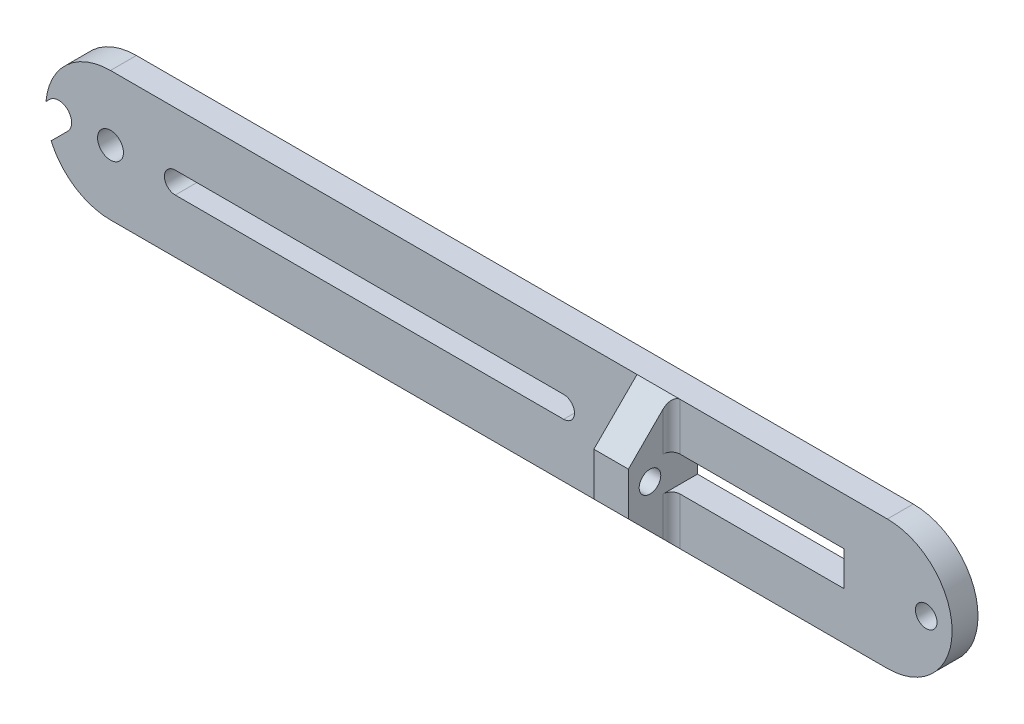
ISO-10303-21;
HEADER;
FILE_DESCRIPTION(('STEP AP214'),'2;1');
FILE_NAME('part.step','',(''),(''),'','','');
FILE_SCHEMA(('AUTOMOTIVE_DESIGN { 1 0 10303 214 1 1 1 1 }'));
ENDSEC;
DATA;
#1=APPLICATION_CONTEXT('core data for automotive mechanical design processes');
#2=APPLICATION_PROTOCOL_DEFINITION('international standard','automotive_design',2000,#1);
#3=PRODUCT_CONTEXT('',#1,'mechanical');
#4=PRODUCT('Part','Part','',(#3));
#5=PRODUCT_RELATED_PRODUCT_CATEGORY('part','',(#4));
#6=PRODUCT_DEFINITION_FORMATION('','',#4);
#7=PRODUCT_DEFINITION_CONTEXT('part definition',#1,'design');
#8=PRODUCT_DEFINITION('design','',#6,#7);
#9=PRODUCT_DEFINITION_SHAPE('','',#8);
#10=(LENGTH_UNIT() NAMED_UNIT(*) SI_UNIT(.MILLI.,.METRE.));
#11=(NAMED_UNIT(*) PLANE_ANGLE_UNIT() SI_UNIT($,.RADIAN.));
#12=(NAMED_UNIT(*) SI_UNIT($,.STERADIAN.) SOLID_ANGLE_UNIT());
#13=UNCERTAINTY_MEASURE_WITH_UNIT(LENGTH_MEASURE(1.E-05),#10,'distance_accuracy_value','');
#14=(GEOMETRIC_REPRESENTATION_CONTEXT(3) GLOBAL_UNCERTAINTY_ASSIGNED_CONTEXT((#13)) GLOBAL_UNIT_ASSIGNED_CONTEXT((#10,
#11,#12)) REPRESENTATION_CONTEXT('',''));
#15=CARTESIAN_POINT('',(0.,0.,0.));
#16=DIRECTION('',(0.,0.,1.));
#17=DIRECTION('',(1.,0.,0.));
#18=AXIS2_PLACEMENT_3D('',#15,#16,#17);
#19=CARTESIAN_POINT('',(90.,0.,6.));
#20=DIRECTION('',(0.,0.,1.));
#21=DIRECTION('',(1.,0.,0.));
#22=AXIS2_PLACEMENT_3D('',#19,#20,#21);
#23=PLANE('',#22);
#24=DIRECTION('',(-1.,0.,0.));
#25=VECTOR('',#24,1.);
#26=CARTESIAN_POINT('',(-75.,2.50000000000001,6.));
#27=LINE('',#26,#25);
#28=CARTESIAN_POINT('',(15.,2.5,6.));
#29=VERTEX_POINT('',#28);
#30=CARTESIAN_POINT('',(-75.,2.50000000000001,6.));
#31=VERTEX_POINT('',#30);
#32=EDGE_CURVE('E407',#29,#31,#27,.T.);
#33=ORIENTED_EDGE('',*,*,#32,.F.);
#34=CARTESIAN_POINT('',(15.,0.,6.));
#35=DIRECTION('',(0.,0.,1.));
#36=DIRECTION('',(1.,0.,0.));
#37=AXIS2_PLACEMENT_3D('',#34,#35,#36);
#38=CIRCLE('',#37,2.5);
#39=CARTESIAN_POINT('',(15.,-2.5,6.));
#40=VERTEX_POINT('',#39);
#41=EDGE_CURVE('E405',#40,#29,#38,.T.);
#42=ORIENTED_EDGE('',*,*,#41,.F.);
#43=DIRECTION('',(1.,0.,0.));
#44=VECTOR('',#43,1.);
#45=CARTESIAN_POINT('',(15.,-2.5,6.));
#46=LINE('',#45,#44);
#47=CARTESIAN_POINT('',(-75.,-2.50000000000001,6.));
#48=VERTEX_POINT('',#47);
#49=EDGE_CURVE('E413',#48,#40,#46,.T.);
#50=ORIENTED_EDGE('',*,*,#49,.F.);
#51=CARTESIAN_POINT('',(-75.,0.,6.));
#52=DIRECTION('',(0.,0.,1.));
#53=DIRECTION('',(1.,0.,0.));
#54=AXIS2_PLACEMENT_3D('',#51,#52,#53);
#55=CIRCLE('',#54,2.50000000000001);
#56=EDGE_CURVE('E410',#31,#48,#55,.T.);
#57=ORIENTED_EDGE('',*,*,#56,.F.);
#58=EDGE_LOOP('',(#33,#42,#50,#57));
#59=FACE_BOUND('',#58,.T.);
#60=CARTESIAN_POINT('',(-90.,0.,6.));
#61=DIRECTION('',(0.,0.,1.));
#62=DIRECTION('',(-1.,0.,0.));
#63=AXIS2_PLACEMENT_3D('',#60,#61,#62);
#64=CIRCLE('',#63,3.00000000000001);
#65=CARTESIAN_POINT('',(-93.,0.,6.));
#66=VERTEX_POINT('',#65);
#67=EDGE_CURVE('E436',#66,#66,#64,.T.);
#68=ORIENTED_EDGE('',*,*,#67,.F.);
#69=EDGE_LOOP('',(#68));
#70=FACE_BOUND('',#69,.T.);
#71=CARTESIAN_POINT('',(-102.,0.,6.));
#72=DIRECTION('',(0.,0.,1.));
#73=DIRECTION('',(1.,0.,0.));
#74=AXIS2_PLACEMENT_3D('',#71,#72,#73);
#75=CIRCLE('',#74,3.00000000000001);
#76=CARTESIAN_POINT('',(-99.8786796564403,-2.12132034355963,6.));
#77=VERTEX_POINT('',#76);
#78=CARTESIAN_POINT('',(-104.12132034356,2.12132034355962,6.));
#79=VERTEX_POINT('',#78);
#80=EDGE_CURVE('E223',#77,#79,#75,.T.);
#81=ORIENTED_EDGE('',*,*,#80,.F.);
#82=DIRECTION('',(-0.707106781186543,-0.707106781186552,0.));
#83=VECTOR('',#82,1.);
#84=CARTESIAN_POINT('',(-48.878679656441,48.8786796564403,6.));
#85=LINE('',#84,#83);
#86=CARTESIAN_POINT('',(-103.750652312537,-5.99329299965612,6.));
#87=VERTEX_POINT('',#86);
#88=EDGE_CURVE('E229',#77,#87,#85,.T.);
#89=ORIENTED_EDGE('',*,*,#88,.T.);
#90=CARTESIAN_POINT('',(-90.,0.,6.));
#91=DIRECTION('',(0.,0.,1.));
#92=DIRECTION('',(-1.,0.,0.));
#93=AXIS2_PLACEMENT_3D('',#90,#91,#92);
#94=CIRCLE('',#93,15.);
#95=CARTESIAN_POINT('',(-90.,-15.,6.));
#96=VERTEX_POINT('',#95);
#97=EDGE_CURVE('E373',#87,#96,#94,.T.);
#98=ORIENTED_EDGE('',*,*,#97,.T.);
#99=DIRECTION('',(1.,0.,0.));
#100=VECTOR('',#99,1.);
#101=CARTESIAN_POINT('',(90.,-15.,6.));
#102=LINE('',#101,#100);
#103=CARTESIAN_POINT('',(32.,-15.,6.));
#104=VERTEX_POINT('',#103);
#105=EDGE_CURVE('E375',#96,#104,#102,.T.);
#106=ORIENTED_EDGE('',*,*,#105,.T.);
#107=DIRECTION('',(0.,1.,0.));
#108=VECTOR('',#107,1.);
#109=CARTESIAN_POINT('',(32.,-15.,6.));
#110=LINE('',#109,#108);
#111=CARTESIAN_POINT('',(32.,15.,6.));
#112=VERTEX_POINT('',#111);
#113=EDGE_CURVE('E301',#104,#112,#110,.T.);
#114=ORIENTED_EDGE('',*,*,#113,.T.);
#115=DIRECTION('',(-1.,0.,0.));
#116=VECTOR('',#115,1.);
#117=CARTESIAN_POINT('',(90.,15.,6.));
#118=LINE('',#117,#116);
#119=CARTESIAN_POINT('',(-90.,15.,6.));
#120=VERTEX_POINT('',#119);
#121=EDGE_CURVE('E371',#112,#120,#118,.T.);
#122=ORIENTED_EDGE('',*,*,#121,.T.);
#123=CARTESIAN_POINT('',(-104.943648089812,1.29899259730734,6.));
#124=VERTEX_POINT('',#123);
#125=EDGE_CURVE('E367',#120,#124,#94,.T.);
#126=ORIENTED_EDGE('',*,*,#125,.T.);
#127=DIRECTION('',(-0.707106781186544,-0.707106781186552,0.));
#128=VECTOR('',#127,1.);
#129=CARTESIAN_POINT('',(-53.1213203435602,53.1213203435596,6.));
#130=LINE('',#129,#128);
#131=EDGE_CURVE('E48',#79,#124,#130,.T.);
#132=ORIENTED_EDGE('',*,*,#131,.F.);
#133=EDGE_LOOP('',(#81,#89,#98,#106,#114,#122,#126,#132));
#134=FACE_BOUND('',#133,.T.);
#135=ADVANCED_FACE('F33',(#59,#70,#134),#23,.T.);
#136=CARTESIAN_POINT('',(90.,0.,0.));
#137=DIRECTION('',(0.,0.,1.));
#138=DIRECTION('',(1.,0.,0.));
#139=AXIS2_PLACEMENT_3D('',#136,#137,#138);
#140=PLANE('',#139);
#141=CARTESIAN_POINT('',(15.,0.,0.));
#142=DIRECTION('',(0.,0.,1.));
#143=DIRECTION('',(1.,0.,0.));
#144=AXIS2_PLACEMENT_3D('',#141,#142,#143);
#145=CIRCLE('',#144,2.5);
#146=CARTESIAN_POINT('',(15.,-2.5,0.));
#147=VERTEX_POINT('',#146);
#148=CARTESIAN_POINT('',(15.,2.5,0.));
#149=VERTEX_POINT('',#148);
#150=EDGE_CURVE('E311',#147,#149,#145,.T.);
#151=ORIENTED_EDGE('',*,*,#150,.T.);
#152=DIRECTION('',(-1.,0.,0.));
#153=VECTOR('',#152,1.);
#154=CARTESIAN_POINT('',(-75.,2.50000000000001,0.));
#155=LINE('',#154,#153);
#156=CARTESIAN_POINT('',(-75.,2.50000000000001,0.));
#157=VERTEX_POINT('',#156);
#158=EDGE_CURVE('E418',#149,#157,#155,.T.);
#159=ORIENTED_EDGE('',*,*,#158,.T.);
#160=CARTESIAN_POINT('',(-75.,0.,0.));
#161=DIRECTION('',(0.,0.,1.));
#162=DIRECTION('',(1.,0.,0.));
#163=AXIS2_PLACEMENT_3D('',#160,#161,#162);
#164=CIRCLE('',#163,2.50000000000001);
#165=CARTESIAN_POINT('',(-75.,-2.50000000000001,0.));
#166=VERTEX_POINT('',#165);
#167=EDGE_CURVE('E421',#157,#166,#164,.T.);
#168=ORIENTED_EDGE('',*,*,#167,.T.);
#169=DIRECTION('',(1.,0.,0.));
#170=VECTOR('',#169,1.);
#171=CARTESIAN_POINT('',(15.,-2.5,0.));
#172=LINE('',#171,#170);
#173=EDGE_CURVE('E408',#166,#147,#172,.T.);
#174=ORIENTED_EDGE('',*,*,#173,.T.);
#175=EDGE_LOOP('',(#151,#159,#168,#174));
#176=FACE_BOUND('',#175,.T.);
#177=CARTESIAN_POINT('',(99.,0.,0.));
#178=DIRECTION('',(0.,0.,1.));
#179=DIRECTION('',(1.,0.,0.));
#180=AXIS2_PLACEMENT_3D('',#177,#178,#179);
#181=CIRCLE('',#180,2.49999999999999);
#182=CARTESIAN_POINT('',(101.5,0.,0.));
#183=VERTEX_POINT('',#182);
#184=EDGE_CURVE('E460',#183,#183,#181,.T.);
#185=ORIENTED_EDGE('',*,*,#184,.T.);
#186=EDGE_LOOP('',(#185));
#187=FACE_BOUND('',#186,.T.);
#188=DIRECTION('',(0.,1.,0.));
#189=VECTOR('',#188,1.);
#190=CARTESIAN_POINT('',(80.,-4.,0.));
#191=LINE('',#190,#189);
#192=CARTESIAN_POINT('',(80.,-4.,0.));
#193=VERTEX_POINT('',#192);
#194=CARTESIAN_POINT('',(80.,4.,0.));
#195=VERTEX_POINT('',#194);
#196=EDGE_CURVE('E439',#193,#195,#191,.T.);
#197=ORIENTED_EDGE('',*,*,#196,.T.);
#198=DIRECTION('',(-1.,0.,0.));
#199=VECTOR('',#198,1.);
#200=CARTESIAN_POINT('',(40.,4.,0.));
#201=LINE('',#200,#199);
#202=CARTESIAN_POINT('',(40.,4.,0.));
#203=VERTEX_POINT('',#202);
#204=EDGE_CURVE('E447',#195,#203,#201,.T.);
#205=ORIENTED_EDGE('',*,*,#204,.T.);
#206=DIRECTION('',(0.,-1.,0.));
#207=VECTOR('',#206,1.);
#208=CARTESIAN_POINT('',(40.,-4.,0.));
#209=LINE('',#208,#207);
#210=CARTESIAN_POINT('',(40.,-4.,0.));
#211=VERTEX_POINT('',#210);
#212=EDGE_CURVE('E450',#203,#211,#209,.T.);
#213=ORIENTED_EDGE('',*,*,#212,.T.);
#214=DIRECTION('',(1.,0.,0.));
#215=VECTOR('',#214,1.);
#216=CARTESIAN_POINT('',(40.,-4.,0.));
#217=LINE('',#216,#215);
#218=EDGE_CURVE('E444',#211,#193,#217,.T.);
#219=ORIENTED_EDGE('',*,*,#218,.T.);
#220=EDGE_LOOP('',(#197,#205,#213,#219));
#221=FACE_BOUND('',#220,.T.);
#222=CARTESIAN_POINT('',(-90.,0.,0.));
#223=DIRECTION('',(0.,0.,1.));
#224=DIRECTION('',(-1.,0.,0.));
#225=AXIS2_PLACEMENT_3D('',#222,#223,#224);
#226=CIRCLE('',#225,3.00000000000001);
#227=CARTESIAN_POINT('',(-93.,0.,0.));
#228=VERTEX_POINT('',#227);
#229=EDGE_CURVE('E435',#228,#228,#226,.T.);
#230=ORIENTED_EDGE('',*,*,#229,.T.);
#231=EDGE_LOOP('',(#230));
#232=FACE_BOUND('',#231,.T.);
#233=DIRECTION('',(-0.707106781186543,-0.707106781186552,0.));
#234=VECTOR('',#233,1.);
#235=CARTESIAN_POINT('',(-3.87867965644158,93.8786796564403,0.));
#236=LINE('',#235,#234);
#237=CARTESIAN_POINT('',(-99.8786796564403,-2.12132034355963,0.));
#238=VERTEX_POINT('',#237);
#239=CARTESIAN_POINT('',(-103.750652312537,-5.99329299965612,0.));
#240=VERTEX_POINT('',#239);
#241=EDGE_CURVE('E243',#238,#240,#236,.T.);
#242=ORIENTED_EDGE('',*,*,#241,.F.);
#243=CARTESIAN_POINT('',(-102.,0.,0.));
#244=DIRECTION('',(0.,0.,1.));
#245=DIRECTION('',(1.,0.,0.));
#246=AXIS2_PLACEMENT_3D('',#243,#244,#245);
#247=CIRCLE('',#246,3.00000000000001);
#248=CARTESIAN_POINT('',(-104.12132034356,2.12132034355962,0.));
#249=VERTEX_POINT('',#248);
#250=EDGE_CURVE('E11',#238,#249,#247,.T.);
#251=ORIENTED_EDGE('',*,*,#250,.T.);
#252=DIRECTION('',(-0.707106781186544,-0.707106781186552,0.));
#253=VECTOR('',#252,1.);
#254=CARTESIAN_POINT('',(-8.12132034356074,98.1213203435596,0.));
#255=LINE('',#254,#253);
#256=CARTESIAN_POINT('',(-104.943648089812,1.29899259730734,0.));
#257=VERTEX_POINT('',#256);
#258=EDGE_CURVE('E239',#249,#257,#255,.T.);
#259=ORIENTED_EDGE('',*,*,#258,.T.);
#260=CARTESIAN_POINT('',(-90.,0.,0.));
#261=DIRECTION('',(0.,0.,1.));
#262=DIRECTION('',(-1.,0.,0.));
#263=AXIS2_PLACEMENT_3D('',#260,#261,#262);
#264=CIRCLE('',#263,15.);
#265=CARTESIAN_POINT('',(-90.,15.,0.));
#266=VERTEX_POINT('',#265);
#267=EDGE_CURVE('E369',#266,#257,#264,.T.);
#268=ORIENTED_EDGE('',*,*,#267,.F.);
#269=DIRECTION('',(-1.,0.,0.));
#270=VECTOR('',#269,1.);
#271=CARTESIAN_POINT('',(90.,15.,0.));
#272=LINE('',#271,#270);
#273=CARTESIAN_POINT('',(90.,15.,0.));
#274=VERTEX_POINT('',#273);
#275=EDGE_CURVE('E532',#274,#266,#272,.T.);
#276=ORIENTED_EDGE('',*,*,#275,.F.);
#277=CARTESIAN_POINT('',(90.,0.,0.));
#278=DIRECTION('',(0.,0.,1.));
#279=DIRECTION('',(1.,0.,0.));
#280=AXIS2_PLACEMENT_3D('',#277,#278,#279);
#281=CIRCLE('',#280,15.);
#282=CARTESIAN_POINT('',(90.,-15.,0.));
#283=VERTEX_POINT('',#282);
#284=EDGE_CURVE('E382',#283,#274,#281,.T.);
#285=ORIENTED_EDGE('',*,*,#284,.F.);
#286=DIRECTION('',(1.,0.,0.));
#287=VECTOR('',#286,1.);
#288=CARTESIAN_POINT('',(90.,-15.,0.));
#289=LINE('',#288,#287);
#290=CARTESIAN_POINT('',(-90.,-15.,0.));
#291=VERTEX_POINT('',#290);
#292=EDGE_CURVE('E467',#291,#283,#289,.T.);
#293=ORIENTED_EDGE('',*,*,#292,.F.);
#294=EDGE_CURVE('E477',#240,#291,#264,.T.);
#295=ORIENTED_EDGE('',*,*,#294,.F.);
#296=EDGE_LOOP('',(#242,#251,#259,#268,#276,#285,#293,#295));
#297=FACE_BOUND('',#296,.T.);
#298=ADVANCED_FACE('F513',(#176,#187,#221,#232,#297),#140,.F.);
#299=CARTESIAN_POINT('',(-90.,0.,6.));
#300=DIRECTION('',(0.,0.,-1.));
#301=DIRECTION('',(-1.,0.,0.));
#302=AXIS2_PLACEMENT_3D('',#299,#300,#301);
#303=CYLINDRICAL_SURFACE('',#302,15.);
#304=DIRECTION('',(0.,0.,-1.));
#305=VECTOR('',#304,1.);
#306=CARTESIAN_POINT('',(-103.750652312537,-5.99329299965612,6.));
#307=LINE('',#306,#305);
#308=EDGE_CURVE('E41',#240,#87,#307,.F.);
#309=ORIENTED_EDGE('',*,*,#308,.F.);
#310=ORIENTED_EDGE('',*,*,#294,.T.);
#311=DIRECTION('',(0.,0.,-1.));
#312=VECTOR('',#311,1.);
#313=CARTESIAN_POINT('',(-90.,-15.,6.));
#314=LINE('',#313,#312);
#315=EDGE_CURVE('E481',#96,#291,#314,.T.);
#316=ORIENTED_EDGE('',*,*,#315,.F.);
#317=ORIENTED_EDGE('',*,*,#97,.F.);
#318=EDGE_LOOP('',(#309,#310,#316,#317));
#319=FACE_BOUND('',#318,.T.);
#320=ADVANCED_FACE('F548',(#319),#303,.T.);
#321=CARTESIAN_POINT('',(90.,15.,6.));
#322=VERTEX_POINT('',#321);
#323=CARTESIAN_POINT('',(42.,15.,6.));
#324=VERTEX_POINT('',#323);
#325=EDGE_CURVE('E376',#322,#324,#118,.T.);
#326=ORIENTED_EDGE('',*,*,#325,.T.);
#327=DIRECTION('',(0.,1.,0.));
#328=VECTOR('',#327,1.);
#329=CARTESIAN_POINT('',(42.,4.,6.));
#330=LINE('',#329,#328);
#331=CARTESIAN_POINT('',(42.,4.,6.));
#332=VERTEX_POINT('',#331);
#333=EDGE_CURVE('E346',#324,#332,#330,.F.);
#334=ORIENTED_EDGE('',*,*,#333,.T.);
#335=DIRECTION('',(-1.,0.,0.));
#336=VECTOR('',#335,1.);
#337=CARTESIAN_POINT('',(40.,4.,6.));
#338=LINE('',#337,#336);
#339=CARTESIAN_POINT('',(80.,4.,6.));
#340=VERTEX_POINT('',#339);
#341=EDGE_CURVE('E334',#340,#332,#338,.T.);
#342=ORIENTED_EDGE('',*,*,#341,.F.);
#343=DIRECTION('',(0.,1.,0.));
#344=VECTOR('',#343,1.);
#345=CARTESIAN_POINT('',(80.,-4.,6.));
#346=LINE('',#345,#344);
#347=CARTESIAN_POINT('',(80.,-4.,6.));
#348=VERTEX_POINT('',#347);
#349=EDGE_CURVE('E442',#348,#340,#346,.T.);
#350=ORIENTED_EDGE('',*,*,#349,.F.);
#351=DIRECTION('',(1.,0.,0.));
#352=VECTOR('',#351,1.);
#353=CARTESIAN_POINT('',(40.,-4.,6.));
#354=LINE('',#353,#352);
#355=CARTESIAN_POINT('',(42.,-4.,6.));
#356=VERTEX_POINT('',#355);
#357=EDGE_CURVE('E337',#356,#348,#354,.T.);
#358=ORIENTED_EDGE('',*,*,#357,.F.);
#359=DIRECTION('',(0.,1.,0.));
#360=VECTOR('',#359,1.);
#361=CARTESIAN_POINT('',(42.,-15.,6.));
#362=LINE('',#361,#360);
#363=CARTESIAN_POINT('',(42.,-15.,6.));
#364=VERTEX_POINT('',#363);
#365=EDGE_CURVE('E343',#356,#364,#362,.F.);
#366=ORIENTED_EDGE('',*,*,#365,.T.);
#367=CARTESIAN_POINT('',(90.,-15.,6.));
#368=VERTEX_POINT('',#367);
#369=EDGE_CURVE('E340',#364,#368,#102,.T.);
#370=ORIENTED_EDGE('',*,*,#369,.T.);
#371=CARTESIAN_POINT('',(90.,0.,6.));
#372=DIRECTION('',(0.,0.,1.));
#373=DIRECTION('',(1.,0.,0.));
#374=AXIS2_PLACEMENT_3D('',#371,#372,#373);
#375=CIRCLE('',#374,15.);
#376=EDGE_CURVE('E465',#368,#322,#375,.T.);
#377=ORIENTED_EDGE('',*,*,#376,.T.);
#378=EDGE_LOOP('',(#326,#334,#342,#350,#358,#366,#370,#377));
#379=FACE_BOUND('',#378,.T.);
#380=CARTESIAN_POINT('',(99.,0.,6.));
#381=DIRECTION('',(0.,0.,1.));
#382=DIRECTION('',(1.,0.,0.));
#383=AXIS2_PLACEMENT_3D('',#380,#381,#382);
#384=CIRCLE('',#383,2.49999999999999);
#385=CARTESIAN_POINT('',(101.5,0.,6.));
#386=VERTEX_POINT('',#385);
#387=EDGE_CURVE('E461',#386,#386,#384,.T.);
#388=ORIENTED_EDGE('',*,*,#387,.F.);
#389=EDGE_LOOP('',(#388));
#390=FACE_BOUND('',#389,.T.);
#391=ADVANCED_FACE('F488',(#379,#390),#23,.T.);
#392=CARTESIAN_POINT('',(90.,0.,6.));
#393=DIRECTION('',(0.,0.,-1.));
#394=DIRECTION('',(-1.,0.,0.));
#395=AXIS2_PLACEMENT_3D('',#392,#393,#394);
#396=CYLINDRICAL_SURFACE('',#395,15.);
#397=ORIENTED_EDGE('',*,*,#284,.T.);
#398=DIRECTION('',(0.,0.,-1.));
#399=VECTOR('',#398,1.);
#400=CARTESIAN_POINT('',(90.,15.,6.));
#401=LINE('',#400,#399);
#402=EDGE_CURVE('E485',#322,#274,#401,.T.);
#403=ORIENTED_EDGE('',*,*,#402,.F.);
#404=ORIENTED_EDGE('',*,*,#376,.F.);
#405=DIRECTION('',(0.,0.,-1.));
#406=VECTOR('',#405,1.);
#407=CARTESIAN_POINT('',(90.,-15.,6.));
#408=LINE('',#407,#406);
#409=EDGE_CURVE('E389',#368,#283,#408,.T.);
#410=ORIENTED_EDGE('',*,*,#409,.T.);
#411=EDGE_LOOP('',(#397,#403,#404,#410));
#412=FACE_BOUND('',#411,.T.);
#413=ADVANCED_FACE('F530',(#412),#396,.T.);
#414=CARTESIAN_POINT('',(90.,15.,6.));
#415=DIRECTION('',(0.,-1.,0.));
#416=DIRECTION('',(0.,0.,-1.));
#417=AXIS2_PLACEMENT_3D('',#414,#415,#416);
#418=PLANE('',#417);
#419=ORIENTED_EDGE('',*,*,#275,.T.);
#420=DIRECTION('',(0.,0.,-1.));
#421=VECTOR('',#420,1.);
#422=CARTESIAN_POINT('',(-90.,15.,6.));
#423=LINE('',#422,#421);
#424=EDGE_CURVE('E483',#120,#266,#423,.T.);
#425=ORIENTED_EDGE('',*,*,#424,.F.);
#426=ORIENTED_EDGE('',*,*,#121,.F.);
#427=DIRECTION('',(1.,0.,0.));
#428=VECTOR('',#427,1.);
#429=CARTESIAN_POINT('',(32.,15.,6.));
#430=LINE('',#429,#428);
#431=EDGE_CURVE('E318',#112,#324,#430,.T.);
#432=ORIENTED_EDGE('',*,*,#431,.T.);
#433=ORIENTED_EDGE('',*,*,#325,.F.);
#434=ORIENTED_EDGE('',*,*,#402,.T.);
#435=EDGE_LOOP('',(#419,#425,#426,#432,#433,#434));
#436=FACE_BOUND('',#435,.T.);
#437=ADVANCED_FACE('F531',(#436),#418,.F.);
#438=ORIENTED_EDGE('',*,*,#267,.T.);
#439=DIRECTION('',(0.,0.,-1.));
#440=VECTOR('',#439,1.);
#441=CARTESIAN_POINT('',(-104.943648089812,1.29899259730734,6.));
#442=LINE('',#441,#440);
#443=EDGE_CURVE('E359',#257,#124,#442,.F.);
#444=ORIENTED_EDGE('',*,*,#443,.T.);
#445=ORIENTED_EDGE('',*,*,#125,.F.);
#446=ORIENTED_EDGE('',*,*,#424,.T.);
#447=EDGE_LOOP('',(#438,#444,#445,#446));
#448=FACE_BOUND('',#447,.T.);
#449=ADVANCED_FACE('F365',(#448),#303,.T.);
#450=CARTESIAN_POINT('',(90.,-15.,6.));
#451=DIRECTION('',(0.,1.,0.));
#452=DIRECTION('',(0.,0.,1.));
#453=AXIS2_PLACEMENT_3D('',#450,#451,#452);
#454=PLANE('',#453);
#455=ORIENTED_EDGE('',*,*,#292,.T.);
#456=ORIENTED_EDGE('',*,*,#409,.F.);
#457=ORIENTED_EDGE('',*,*,#369,.F.);
#458=DIRECTION('',(1.,0.,0.));
#459=VECTOR('',#458,1.);
#460=CARTESIAN_POINT('',(32.,-15.,6.));
#461=LINE('',#460,#459);
#462=EDGE_CURVE('E309',#104,#364,#461,.T.);
#463=ORIENTED_EDGE('',*,*,#462,.F.);
#464=ORIENTED_EDGE('',*,*,#105,.F.);
#465=ORIENTED_EDGE('',*,*,#315,.T.);
#466=EDGE_LOOP('',(#455,#456,#457,#463,#464,#465));
#467=FACE_BOUND('',#466,.T.);
#468=ADVANCED_FACE('F525',(#467),#454,.F.);
#469=CARTESIAN_POINT('',(99.,0.,6.));
#470=DIRECTION('',(0.,0.,-1.));
#471=DIRECTION('',(-1.,0.,0.));
#472=AXIS2_PLACEMENT_3D('',#469,#470,#471);
#473=CYLINDRICAL_SURFACE('',#472,2.49999999999999);
#474=ORIENTED_EDGE('',*,*,#387,.T.);
#475=EDGE_LOOP('',(#474));
#476=FACE_BOUND('',#475,.T.);
#477=ORIENTED_EDGE('',*,*,#184,.F.);
#478=EDGE_LOOP('',(#477));
#479=FACE_BOUND('',#478,.T.);
#480=ADVANCED_FACE('F571',(#476,#479),#473,.F.);
#481=CARTESIAN_POINT('',(80.,-4.,6.));
#482=DIRECTION('',(-1.,0.,0.));
#483=DIRECTION('',(0.,0.,1.));
#484=AXIS2_PLACEMENT_3D('',#481,#482,#483);
#485=PLANE('',#484);
#486=ORIENTED_EDGE('',*,*,#196,.F.);
#487=DIRECTION('',(0.,0.,-1.));
#488=VECTOR('',#487,1.);
#489=CARTESIAN_POINT('',(80.,-4.,6.));
#490=LINE('',#489,#488);
#491=EDGE_CURVE('E329',#348,#193,#490,.T.);
#492=ORIENTED_EDGE('',*,*,#491,.F.);
#493=ORIENTED_EDGE('',*,*,#349,.T.);
#494=DIRECTION('',(0.,0.,-1.));
#495=VECTOR('',#494,1.);
#496=CARTESIAN_POINT('',(80.,4.,6.));
#497=LINE('',#496,#495);
#498=EDGE_CURVE('E457',#340,#195,#497,.T.);
#499=ORIENTED_EDGE('',*,*,#498,.T.);
#500=EDGE_LOOP('',(#486,#492,#493,#499));
#501=FACE_BOUND('',#500,.T.);
#502=ADVANCED_FACE('F508',(#501),#485,.T.);
#503=CARTESIAN_POINT('',(40.,4.,6.));
#504=DIRECTION('',(0.,-1.,0.));
#505=DIRECTION('',(0.,0.,-1.));
#506=AXIS2_PLACEMENT_3D('',#503,#504,#505);
#507=PLANE('',#506);
#508=ORIENTED_EDGE('',*,*,#204,.F.);
#509=ORIENTED_EDGE('',*,*,#498,.F.);
#510=ORIENTED_EDGE('',*,*,#341,.T.);
#511=CARTESIAN_POINT('',(42.,4.,8.));
#512=DIRECTION('',(0.,-1.,0.));
#513=DIRECTION('',(0.,0.,-1.));
#514=AXIS2_PLACEMENT_3D('',#511,#512,#513);
#515=CIRCLE('',#514,2.);
#516=CARTESIAN_POINT('',(40.,4.,8.));
#517=VERTEX_POINT('',#516);
#518=EDGE_CURVE('E352',#332,#517,#515,.F.);
#519=ORIENTED_EDGE('',*,*,#518,.T.);
#520=DIRECTION('',(0.,0.,-1.));
#521=VECTOR('',#520,1.);
#522=CARTESIAN_POINT('',(40.,4.,6.));
#523=LINE('',#522,#521);
#524=EDGE_CURVE('E328',#517,#203,#523,.T.);
#525=ORIENTED_EDGE('',*,*,#524,.T.);
#526=EDGE_LOOP('',(#508,#509,#510,#519,#525));
#527=FACE_BOUND('',#526,.T.);
#528=ADVANCED_FACE('F500',(#527),#507,.T.);
#529=CARTESIAN_POINT('',(40.,-4.,6.));
#530=DIRECTION('',(1.,0.,0.));
#531=DIRECTION('',(0.,0.,-1.));
#532=AXIS2_PLACEMENT_3D('',#529,#530,#531);
#533=PLANE('',#532);
#534=ORIENTED_EDGE('',*,*,#524,.F.);
#535=DIRECTION('',(0.,1.,0.));
#536=VECTOR('',#535,1.);
#537=CARTESIAN_POINT('',(40.,15.,8.));
#538=LINE('',#537,#536);
#539=CARTESIAN_POINT('',(40.,13.,8.));
#540=VERTEX_POINT('',#539);
#541=EDGE_CURVE('E347',#517,#540,#538,.T.);
#542=ORIENTED_EDGE('',*,*,#541,.T.);
#543=DIRECTION('',(0.,-0.707106781186548,0.707106781186548));
#544=VECTOR('',#543,1.);
#545=CARTESIAN_POINT('',(40.,15.,6.));
#546=LINE('',#545,#544);
#547=CARTESIAN_POINT('',(40.,5.,16.));
#548=VERTEX_POINT('',#547);
#549=EDGE_CURVE('E295',#540,#548,#546,.T.);
#550=ORIENTED_EDGE('',*,*,#549,.T.);
#551=DIRECTION('',(0.,-1.,0.));
#552=VECTOR('',#551,1.);
#553=CARTESIAN_POINT('',(40.,5.,16.));
#554=LINE('',#553,#552);
#555=CARTESIAN_POINT('',(40.,-5.,16.));
#556=VERTEX_POINT('',#555);
#557=EDGE_CURVE('E323',#548,#556,#554,.T.);
#558=ORIENTED_EDGE('',*,*,#557,.T.);
#559=DIRECTION('',(0.,-0.707106781186547,-0.707106781186548));
#560=VECTOR('',#559,1.);
#561=CARTESIAN_POINT('',(40.,-15.,6.));
#562=LINE('',#561,#560);
#563=CARTESIAN_POINT('',(40.,-13.,8.));
#564=VERTEX_POINT('',#563);
#565=EDGE_CURVE('E306',#556,#564,#562,.T.);
#566=ORIENTED_EDGE('',*,*,#565,.T.);
#567=DIRECTION('',(0.,1.,0.));
#568=VECTOR('',#567,1.);
#569=CARTESIAN_POINT('',(40.,-4.,8.));
#570=LINE('',#569,#568);
#571=CARTESIAN_POINT('',(40.,-4.,8.));
#572=VERTEX_POINT('',#571);
#573=EDGE_CURVE('E487',#564,#572,#570,.T.);
#574=ORIENTED_EDGE('',*,*,#573,.T.);
#575=DIRECTION('',(0.,0.,-1.));
#576=VECTOR('',#575,1.);
#577=CARTESIAN_POINT('',(40.,-4.,6.));
#578=LINE('',#577,#576);
#579=EDGE_CURVE('E326',#572,#211,#578,.T.);
#580=ORIENTED_EDGE('',*,*,#579,.T.);
#581=ORIENTED_EDGE('',*,*,#212,.F.);
#582=EDGE_LOOP('',(#534,#542,#550,#558,#566,#574,#580,#581));
#583=FACE_BOUND('',#582,.T.);
#584=CARTESIAN_POINT('',(40.,0.,11.));
#585=DIRECTION('',(1.,0.,0.));
#586=DIRECTION('',(0.,0.,-1.));
#587=AXIS2_PLACEMENT_3D('',#584,#585,#586);
#588=CIRCLE('',#587,2.5);
#589=CARTESIAN_POINT('',(40.,0.,8.5));
#590=VERTEX_POINT('',#589);
#591=EDGE_CURVE('E292',#590,#590,#588,.T.);
#592=ORIENTED_EDGE('',*,*,#591,.F.);
#593=EDGE_LOOP('',(#592));
#594=FACE_BOUND('',#593,.T.);
#595=ADVANCED_FACE('F516',(#583,#594),#533,.T.);
#596=CARTESIAN_POINT('',(40.,-4.,6.));
#597=DIRECTION('',(0.,1.,0.));
#598=DIRECTION('',(0.,0.,1.));
#599=AXIS2_PLACEMENT_3D('',#596,#597,#598);
#600=PLANE('',#599);
#601=ORIENTED_EDGE('',*,*,#218,.F.);
#602=ORIENTED_EDGE('',*,*,#579,.F.);
#603=CARTESIAN_POINT('',(42.,-4.,8.));
#604=DIRECTION('',(0.,1.,0.));
#605=DIRECTION('',(0.,0.,1.));
#606=AXIS2_PLACEMENT_3D('',#603,#604,#605);
#607=CIRCLE('',#606,2.);
#608=EDGE_CURVE('E355',#572,#356,#607,.F.);
#609=ORIENTED_EDGE('',*,*,#608,.T.);
#610=ORIENTED_EDGE('',*,*,#357,.T.);
#611=ORIENTED_EDGE('',*,*,#491,.T.);
#612=EDGE_LOOP('',(#601,#602,#609,#610,#611));
#613=FACE_BOUND('',#612,.T.);
#614=ADVANCED_FACE('F511',(#613),#600,.T.);
#615=CARTESIAN_POINT('',(-90.,0.,6.));
#616=DIRECTION('',(0.,0.,-1.));
#617=DIRECTION('',(-1.,0.,0.));
#618=AXIS2_PLACEMENT_3D('',#615,#616,#617);
#619=CYLINDRICAL_SURFACE('',#618,3.00000000000001);
#620=ORIENTED_EDGE('',*,*,#67,.T.);
#621=EDGE_LOOP('',(#620));
#622=FACE_BOUND('',#621,.T.);
#623=ORIENTED_EDGE('',*,*,#229,.F.);
#624=EDGE_LOOP('',(#623));
#625=FACE_BOUND('',#624,.T.);
#626=ADVANCED_FACE('F619',(#622,#625),#619,.F.);
#627=CARTESIAN_POINT('',(15.,0.,6.));
#628=DIRECTION('',(0.,0.,-1.));
#629=DIRECTION('',(-1.,0.,0.));
#630=AXIS2_PLACEMENT_3D('',#627,#628,#629);
#631=CYLINDRICAL_SURFACE('',#630,2.5);
#632=ORIENTED_EDGE('',*,*,#150,.F.);
#633=DIRECTION('',(0.,0.,-1.));
#634=VECTOR('',#633,1.);
#635=CARTESIAN_POINT('',(15.,-2.5,6.));
#636=LINE('',#635,#634);
#637=EDGE_CURVE('E415',#40,#147,#636,.T.);
#638=ORIENTED_EDGE('',*,*,#637,.F.);
#639=ORIENTED_EDGE('',*,*,#41,.T.);
#640=DIRECTION('',(0.,0.,-1.));
#641=VECTOR('',#640,1.);
#642=CARTESIAN_POINT('',(15.,2.5,6.));
#643=LINE('',#642,#641);
#644=EDGE_CURVE('E432',#29,#149,#643,.T.);
#645=ORIENTED_EDGE('',*,*,#644,.T.);
#646=EDGE_LOOP('',(#632,#638,#639,#645));
#647=FACE_BOUND('',#646,.T.);
#648=ADVANCED_FACE('F615',(#647),#631,.F.);
#649=CARTESIAN_POINT('',(-75.,2.50000000000001,6.));
#650=DIRECTION('',(0.,-1.,0.));
#651=DIRECTION('',(1.,0.,0.));
#652=AXIS2_PLACEMENT_3D('',#649,#650,#651);
#653=PLANE('',#652);
#654=ORIENTED_EDGE('',*,*,#158,.F.);
#655=ORIENTED_EDGE('',*,*,#644,.F.);
#656=ORIENTED_EDGE('',*,*,#32,.T.);
#657=DIRECTION('',(0.,0.,-1.));
#658=VECTOR('',#657,1.);
#659=CARTESIAN_POINT('',(-75.,2.50000000000001,6.));
#660=LINE('',#659,#658);
#661=EDGE_CURVE('E430',#31,#157,#660,.T.);
#662=ORIENTED_EDGE('',*,*,#661,.T.);
#663=EDGE_LOOP('',(#654,#655,#656,#662));
#664=FACE_BOUND('',#663,.T.);
#665=ADVANCED_FACE('F611',(#664),#653,.T.);
#666=CARTESIAN_POINT('',(-75.,0.,6.));
#667=DIRECTION('',(0.,0.,-1.));
#668=DIRECTION('',(-1.,0.,0.));
#669=AXIS2_PLACEMENT_3D('',#666,#667,#668);
#670=CYLINDRICAL_SURFACE('',#669,2.50000000000001);
#671=ORIENTED_EDGE('',*,*,#167,.F.);
#672=ORIENTED_EDGE('',*,*,#661,.F.);
#673=ORIENTED_EDGE('',*,*,#56,.T.);
#674=DIRECTION('',(0.,0.,-1.));
#675=VECTOR('',#674,1.);
#676=CARTESIAN_POINT('',(-75.,-2.50000000000001,6.));
#677=LINE('',#676,#675);
#678=EDGE_CURVE('E428',#48,#166,#677,.T.);
#679=ORIENTED_EDGE('',*,*,#678,.T.);
#680=EDGE_LOOP('',(#671,#672,#673,#679));
#681=FACE_BOUND('',#680,.T.);
#682=ADVANCED_FACE('F607',(#681),#670,.F.);
#683=CARTESIAN_POINT('',(15.,-2.5,6.));
#684=DIRECTION('',(0.,1.,0.));
#685=DIRECTION('',(-1.,0.,0.));
#686=AXIS2_PLACEMENT_3D('',#683,#684,#685);
#687=PLANE('',#686);
#688=ORIENTED_EDGE('',*,*,#173,.F.);
#689=ORIENTED_EDGE('',*,*,#678,.F.);
#690=ORIENTED_EDGE('',*,*,#49,.T.);
#691=ORIENTED_EDGE('',*,*,#637,.T.);
#692=EDGE_LOOP('',(#688,#689,#690,#691));
#693=FACE_BOUND('',#692,.T.);
#694=ADVANCED_FACE('F598',(#693),#687,.T.);
#695=CARTESIAN_POINT('',(32.,-15.,6.));
#696=DIRECTION('',(0.,-0.707106781186548,0.707106781186547));
#697=DIRECTION('',(0.,-0.707106781186547,-0.707106781186548));
#698=AXIS2_PLACEMENT_3D('',#695,#696,#697);
#699=PLANE('',#698);
#700=ORIENTED_EDGE('',*,*,#565,.F.);
#701=DIRECTION('',(1.,0.,0.));
#702=VECTOR('',#701,1.);
#703=CARTESIAN_POINT('',(32.,-5.,16.));
#704=LINE('',#703,#702);
#705=CARTESIAN_POINT('',(32.,-5.,16.));
#706=VERTEX_POINT('',#705);
#707=EDGE_CURVE('E312',#706,#556,#704,.T.);
#708=ORIENTED_EDGE('',*,*,#707,.F.);
#709=DIRECTION('',(0.,-0.707106781186547,-0.707106781186548));
#710=VECTOR('',#709,1.);
#711=CARTESIAN_POINT('',(32.,-15.,6.));
#712=LINE('',#711,#710);
#713=EDGE_CURVE('E315',#706,#104,#712,.T.);
#714=ORIENTED_EDGE('',*,*,#713,.T.);
#715=ORIENTED_EDGE('',*,*,#462,.T.);
#716=CARTESIAN_POINT('',(42.,-13.,8.));
#717=DIRECTION('',(0.,-0.707106781186548,0.707106781186547));
#718=DIRECTION('',(0.,-0.707106781186547,-0.707106781186548));
#719=AXIS2_PLACEMENT_3D('',#716,#717,#718);
#720=ELLIPSE('',#719,2.82842712474619,2.);
#721=EDGE_CURVE('E357',#364,#564,#720,.F.);
#722=ORIENTED_EDGE('',*,*,#721,.T.);
#723=EDGE_LOOP('',(#700,#708,#714,#715,#722));
#724=FACE_BOUND('',#723,.T.);
#725=ADVANCED_FACE('F594',(#724),#699,.T.);
#726=CARTESIAN_POINT('',(32.,5.,16.));
#727=DIRECTION('',(0.,0.,1.));
#728=DIRECTION('',(1.,0.,0.));
#729=AXIS2_PLACEMENT_3D('',#726,#727,#728);
#730=PLANE('',#729);
#731=ORIENTED_EDGE('',*,*,#557,.F.);
#732=DIRECTION('',(1.,0.,0.));
#733=VECTOR('',#732,1.);
#734=CARTESIAN_POINT('',(32.,5.,16.));
#735=LINE('',#734,#733);
#736=CARTESIAN_POINT('',(32.,5.,16.));
#737=VERTEX_POINT('',#736);
#738=EDGE_CURVE('E394',#737,#548,#735,.T.);
#739=ORIENTED_EDGE('',*,*,#738,.F.);
#740=DIRECTION('',(0.,-1.,0.));
#741=VECTOR('',#740,1.);
#742=CARTESIAN_POINT('',(32.,5.,16.));
#743=LINE('',#742,#741);
#744=EDGE_CURVE('E298',#737,#706,#743,.T.);
#745=ORIENTED_EDGE('',*,*,#744,.T.);
#746=ORIENTED_EDGE('',*,*,#707,.T.);
#747=EDGE_LOOP('',(#731,#739,#745,#746));
#748=FACE_BOUND('',#747,.T.);
#749=ADVANCED_FACE('F597',(#748),#730,.T.);
#750=CARTESIAN_POINT('',(32.,15.,6.));
#751=DIRECTION('',(0.,0.707106781186547,0.707106781186547));
#752=DIRECTION('',(0.,-0.707106781186548,0.707106781186548));
#753=AXIS2_PLACEMENT_3D('',#750,#751,#752);
#754=PLANE('',#753);
#755=ORIENTED_EDGE('',*,*,#549,.F.);
#756=CARTESIAN_POINT('',(42.,13.,8.));
#757=DIRECTION('',(0.,0.707106781186547,0.707106781186547));
#758=DIRECTION('',(0.,-0.707106781186548,0.707106781186548));
#759=AXIS2_PLACEMENT_3D('',#756,#757,#758);
#760=ELLIPSE('',#759,2.82842712474619,2.);
#761=EDGE_CURVE('E349',#540,#324,#760,.F.);
#762=ORIENTED_EDGE('',*,*,#761,.T.);
#763=ORIENTED_EDGE('',*,*,#431,.F.);
#764=DIRECTION('',(0.,-0.707106781186548,0.707106781186548));
#765=VECTOR('',#764,1.);
#766=CARTESIAN_POINT('',(32.,15.,6.));
#767=LINE('',#766,#765);
#768=EDGE_CURVE('E305',#112,#737,#767,.T.);
#769=ORIENTED_EDGE('',*,*,#768,.T.);
#770=ORIENTED_EDGE('',*,*,#738,.T.);
#771=EDGE_LOOP('',(#755,#762,#763,#769,#770));
#772=FACE_BOUND('',#771,.T.);
#773=ADVANCED_FACE('F493',(#772),#754,.T.);
#774=CARTESIAN_POINT('',(32.,0.,0.));
#775=DIRECTION('',(1.,0.,0.));
#776=DIRECTION('',(0.,0.,-1.));
#777=AXIS2_PLACEMENT_3D('',#774,#775,#776);
#778=PLANE('',#777);
#779=DIRECTION('',(0.,0.500000000000001,-0.866025403784438));
#780=VECTOR('',#779,1.);
#781=CARTESIAN_POINT('',(32.,4.,11.));
#782=LINE('',#781,#780);
#783=CARTESIAN_POINT('',(32.,1.99999999999999,14.4641016151378));
#784=VERTEX_POINT('',#783);
#785=CARTESIAN_POINT('',(32.,4.,11.));
#786=VERTEX_POINT('',#785);
#787=EDGE_CURVE('E266',#784,#786,#782,.T.);
#788=ORIENTED_EDGE('',*,*,#787,.F.);
#789=DIRECTION('',(0.,1.,0.));
#790=VECTOR('',#789,1.);
#791=CARTESIAN_POINT('',(32.,1.99999999999999,14.4641016151378));
#792=LINE('',#791,#790);
#793=CARTESIAN_POINT('',(32.,-2.00000000000002,14.4641016151377));
#794=VERTEX_POINT('',#793);
#795=EDGE_CURVE('E56',#794,#784,#792,.T.);
#796=ORIENTED_EDGE('',*,*,#795,.F.);
#797=DIRECTION('',(0.,0.499999999999998,0.86602540378444));
#798=VECTOR('',#797,1.);
#799=CARTESIAN_POINT('',(32.,-2.00000000000002,14.4641016151377));
#800=LINE('',#799,#798);
#801=CARTESIAN_POINT('',(32.,-4.,11.));
#802=VERTEX_POINT('',#801);
#803=EDGE_CURVE('E249',#802,#794,#800,.T.);
#804=ORIENTED_EDGE('',*,*,#803,.F.);
#805=DIRECTION('',(0.,-0.499999999999998,0.86602540378444));
#806=VECTOR('',#805,1.);
#807=CARTESIAN_POINT('',(32.,-2.00000000000002,7.53589838486225));
#808=LINE('',#807,#806);
#809=CARTESIAN_POINT('',(32.,-2.00000000000002,7.53589838486225));
#810=VERTEX_POINT('',#809);
#811=EDGE_CURVE('E275',#810,#802,#808,.T.);
#812=ORIENTED_EDGE('',*,*,#811,.F.);
#813=DIRECTION('',(0.,-1.,0.));
#814=VECTOR('',#813,1.);
#815=CARTESIAN_POINT('',(32.,1.99999999999999,7.53589838486224));
#816=LINE('',#815,#814);
#817=CARTESIAN_POINT('',(32.,1.99999999999999,7.53589838486224));
#818=VERTEX_POINT('',#817);
#819=EDGE_CURVE('E272',#818,#810,#816,.T.);
#820=ORIENTED_EDGE('',*,*,#819,.F.);
#821=DIRECTION('',(0.,-0.500000000000001,-0.866025403784438));
#822=VECTOR('',#821,1.);
#823=CARTESIAN_POINT('',(32.,4.,11.));
#824=LINE('',#823,#822);
#825=EDGE_CURVE('E269',#786,#818,#824,.T.);
#826=ORIENTED_EDGE('',*,*,#825,.F.);
#827=EDGE_LOOP('',(#788,#796,#804,#812,#820,#826));
#828=FACE_BOUND('',#827,.T.);
#829=ORIENTED_EDGE('',*,*,#113,.F.);
#830=ORIENTED_EDGE('',*,*,#713,.F.);
#831=ORIENTED_EDGE('',*,*,#744,.F.);
#832=ORIENTED_EDGE('',*,*,#768,.F.);
#833=EDGE_LOOP('',(#829,#830,#831,#832));
#834=FACE_BOUND('',#833,.T.);
#835=ADVANCED_FACE('F581',(#828,#834),#778,.F.);
#836=CARTESIAN_POINT('',(32.,0.,11.));
#837=DIRECTION('',(1.,0.,0.));
#838=DIRECTION('',(0.,0.,-1.));
#839=AXIS2_PLACEMENT_3D('',#836,#837,#838);
#840=CYLINDRICAL_SURFACE('',#839,2.5);
#841=CARTESIAN_POINT('',(36.,0.,11.));
#842=DIRECTION('',(1.,0.,0.));
#843=DIRECTION('',(0.,0.,-1.));
#844=AXIS2_PLACEMENT_3D('',#841,#842,#843);
#845=CIRCLE('',#844,2.5);
#846=CARTESIAN_POINT('',(36.,0.,8.5));
#847=VERTEX_POINT('',#846);
#848=EDGE_CURVE('E282',#847,#847,#845,.F.);
#849=ORIENTED_EDGE('',*,*,#848,.T.);
#850=EDGE_LOOP('',(#849));
#851=FACE_BOUND('',#850,.T.);
#852=ORIENTED_EDGE('',*,*,#591,.T.);
#853=EDGE_LOOP('',(#852));
#854=FACE_BOUND('',#853,.T.);
#855=ADVANCED_FACE('F575',(#851,#854),#840,.F.);
#856=CARTESIAN_POINT('',(42.,-4.,8.));
#857=DIRECTION('',(0.,-1.,0.));
#858=DIRECTION('',(0.,0.,-1.));
#859=AXIS2_PLACEMENT_3D('',#856,#857,#858);
#860=CYLINDRICAL_SURFACE('',#859,2.);
#861=ORIENTED_EDGE('',*,*,#518,.F.);
#862=ORIENTED_EDGE('',*,*,#333,.F.);
#863=ORIENTED_EDGE('',*,*,#761,.F.);
#864=ORIENTED_EDGE('',*,*,#541,.F.);
#865=EDGE_LOOP('',(#861,#862,#863,#864));
#866=FACE_BOUND('',#865,.T.);
#867=ADVANCED_FACE('F498',(#866),#860,.F.);
#868=CARTESIAN_POINT('',(42.,-4.,8.));
#869=DIRECTION('',(0.,-1.,0.));
#870=DIRECTION('',(0.,0.,-1.));
#871=AXIS2_PLACEMENT_3D('',#868,#869,#870);
#872=CYLINDRICAL_SURFACE('',#871,2.);
#873=ORIENTED_EDGE('',*,*,#721,.F.);
#874=ORIENTED_EDGE('',*,*,#365,.F.);
#875=ORIENTED_EDGE('',*,*,#608,.F.);
#876=ORIENTED_EDGE('',*,*,#573,.F.);
#877=EDGE_LOOP('',(#873,#874,#875,#876));
#878=FACE_BOUND('',#877,.T.);
#879=ADVANCED_FACE('F35',(#878),#872,.F.);
#880=CARTESIAN_POINT('',(36.,0.,0.));
#881=DIRECTION('',(1.,0.,0.));
#882=DIRECTION('',(0.,0.,-1.));
#883=AXIS2_PLACEMENT_3D('',#880,#881,#882);
#884=PLANE('',#883);
#885=DIRECTION('',(0.,1.,0.));
#886=VECTOR('',#885,1.);
#887=CARTESIAN_POINT('',(36.,1.99999999999999,14.4641016151378));
#888=LINE('',#887,#886);
#889=CARTESIAN_POINT('',(36.,-2.00000000000002,14.4641016151377));
#890=VERTEX_POINT('',#889);
#891=CARTESIAN_POINT('',(36.,1.99999999999999,14.4641016151378));
#892=VERTEX_POINT('',#891);
#893=EDGE_CURVE('E245',#890,#892,#888,.T.);
#894=ORIENTED_EDGE('',*,*,#893,.T.);
#895=DIRECTION('',(0.,0.500000000000001,-0.866025403784438));
#896=VECTOR('',#895,1.);
#897=CARTESIAN_POINT('',(36.,4.,11.));
#898=LINE('',#897,#896);
#899=CARTESIAN_POINT('',(36.,4.,11.));
#900=VERTEX_POINT('',#899);
#901=EDGE_CURVE('E248',#892,#900,#898,.T.);
#902=ORIENTED_EDGE('',*,*,#901,.T.);
#903=DIRECTION('',(0.,-0.500000000000001,-0.866025403784438));
#904=VECTOR('',#903,1.);
#905=CARTESIAN_POINT('',(36.,4.,11.));
#906=LINE('',#905,#904);
#907=CARTESIAN_POINT('',(36.,1.99999999999999,7.53589838486224));
#908=VERTEX_POINT('',#907);
#909=EDGE_CURVE('E252',#900,#908,#906,.T.);
#910=ORIENTED_EDGE('',*,*,#909,.T.);
#911=DIRECTION('',(0.,-1.,0.));
#912=VECTOR('',#911,1.);
#913=CARTESIAN_POINT('',(36.,1.99999999999999,7.53589838486224));
#914=LINE('',#913,#912);
#915=CARTESIAN_POINT('',(36.,-2.00000000000002,7.53589838486225));
#916=VERTEX_POINT('',#915);
#917=EDGE_CURVE('E255',#908,#916,#914,.T.);
#918=ORIENTED_EDGE('',*,*,#917,.T.);
#919=DIRECTION('',(0.,-0.499999999999998,0.86602540378444));
#920=VECTOR('',#919,1.);
#921=CARTESIAN_POINT('',(36.,-2.00000000000002,7.53589838486225));
#922=LINE('',#921,#920);
#923=CARTESIAN_POINT('',(36.,-4.,11.));
#924=VERTEX_POINT('',#923);
#925=EDGE_CURVE('E258',#916,#924,#922,.T.);
#926=ORIENTED_EDGE('',*,*,#925,.T.);
#927=DIRECTION('',(0.,0.499999999999998,0.86602540378444));
#928=VECTOR('',#927,1.);
#929=CARTESIAN_POINT('',(36.,-2.00000000000002,14.4641016151377));
#930=LINE('',#929,#928);
#931=EDGE_CURVE('E261',#924,#890,#930,.T.);
#932=ORIENTED_EDGE('',*,*,#931,.T.);
#933=EDGE_LOOP('',(#894,#902,#910,#918,#926,#932));
#934=FACE_BOUND('',#933,.T.);
#935=ORIENTED_EDGE('',*,*,#848,.F.);
#936=EDGE_LOOP('',(#935));
#937=FACE_BOUND('',#936,.T.);
#938=ADVANCED_FACE('F580',(#934,#937),#884,.F.);
#939=CARTESIAN_POINT('',(36.,1.99999999999999,14.4641016151378));
#940=DIRECTION('',(0.,0.,1.));
#941=DIRECTION('',(0.,-1.,0.));
#942=AXIS2_PLACEMENT_3D('',#939,#940,#941);
#943=PLANE('',#942);
#944=ORIENTED_EDGE('',*,*,#795,.T.);
#945=DIRECTION('',(-1.,0.,0.));
#946=VECTOR('',#945,1.);
#947=CARTESIAN_POINT('',(36.,1.99999999999999,14.4641016151378));
#948=LINE('',#947,#946);
#949=EDGE_CURVE('E264',#892,#784,#948,.T.);
#950=ORIENTED_EDGE('',*,*,#949,.F.);
#951=ORIENTED_EDGE('',*,*,#893,.F.);
#952=DIRECTION('',(-1.,0.,0.));
#953=VECTOR('',#952,1.);
#954=CARTESIAN_POINT('',(36.,-2.00000000000002,14.4641016151377));
#955=LINE('',#954,#953);
#956=EDGE_CURVE('E280',#890,#794,#955,.T.);
#957=ORIENTED_EDGE('',*,*,#956,.T.);
#958=EDGE_LOOP('',(#944,#950,#951,#957));
#959=FACE_BOUND('',#958,.T.);
#960=ADVANCED_FACE('F591',(#959),#943,.F.);
#961=CARTESIAN_POINT('',(36.,-2.00000000000002,14.4641016151377));
#962=DIRECTION('',(0.,-0.86602540378444,0.499999999999998));
#963=DIRECTION('',(0.,-0.499999999999998,-0.86602540378444));
#964=AXIS2_PLACEMENT_3D('',#961,#962,#963);
#965=PLANE('',#964);
#966=ORIENTED_EDGE('',*,*,#803,.T.);
#967=ORIENTED_EDGE('',*,*,#956,.F.);
#968=ORIENTED_EDGE('',*,*,#931,.F.);
#969=DIRECTION('',(-1.,0.,0.));
#970=VECTOR('',#969,1.);
#971=CARTESIAN_POINT('',(36.,-4.,11.));
#972=LINE('',#971,#970);
#973=EDGE_CURVE('E283',#924,#802,#972,.T.);
#974=ORIENTED_EDGE('',*,*,#973,.T.);
#975=EDGE_LOOP('',(#966,#967,#968,#974));
#976=FACE_BOUND('',#975,.T.);
#977=ADVANCED_FACE('F720',(#976),#965,.F.);
#978=CARTESIAN_POINT('',(36.,-2.00000000000002,7.53589838486225));
#979=DIRECTION('',(0.,-0.86602540378444,-0.499999999999998));
#980=DIRECTION('',(0.,0.499999999999998,-0.86602540378444));
#981=AXIS2_PLACEMENT_3D('',#978,#979,#980);
#982=PLANE('',#981);
#983=ORIENTED_EDGE('',*,*,#811,.T.);
#984=ORIENTED_EDGE('',*,*,#973,.F.);
#985=ORIENTED_EDGE('',*,*,#925,.F.);
#986=DIRECTION('',(-1.,0.,0.));
#987=VECTOR('',#986,1.);
#988=CARTESIAN_POINT('',(36.,-2.00000000000002,7.53589838486225));
#989=LINE('',#988,#987);
#990=EDGE_CURVE('E285',#916,#810,#989,.T.);
#991=ORIENTED_EDGE('',*,*,#990,.T.);
#992=EDGE_LOOP('',(#983,#984,#985,#991));
#993=FACE_BOUND('',#992,.T.);
#994=ADVANCED_FACE('F728',(#993),#982,.F.);
#995=CARTESIAN_POINT('',(36.,1.99999999999999,7.53589838486224));
#996=DIRECTION('',(0.,0.,-1.));
#997=DIRECTION('',(0.,1.,0.));
#998=AXIS2_PLACEMENT_3D('',#995,#996,#997);
#999=PLANE('',#998);
#1000=ORIENTED_EDGE('',*,*,#819,.T.);
#1001=ORIENTED_EDGE('',*,*,#990,.F.);
#1002=ORIENTED_EDGE('',*,*,#917,.F.);
#1003=DIRECTION('',(-1.,0.,0.));
#1004=VECTOR('',#1003,1.);
#1005=CARTESIAN_POINT('',(36.,1.99999999999999,7.53589838486224));
#1006=LINE('',#1005,#1004);
#1007=EDGE_CURVE('E287',#908,#818,#1006,.T.);
#1008=ORIENTED_EDGE('',*,*,#1007,.T.);
#1009=EDGE_LOOP('',(#1000,#1001,#1002,#1008));
#1010=FACE_BOUND('',#1009,.T.);
#1011=ADVANCED_FACE('F738',(#1010),#999,.F.);
#1012=CARTESIAN_POINT('',(36.,4.,11.));
#1013=DIRECTION('',(0.,0.866025403784438,-0.500000000000001));
#1014=DIRECTION('',(0.,0.500000000000001,0.866025403784438));
#1015=AXIS2_PLACEMENT_3D('',#1012,#1013,#1014);
#1016=PLANE('',#1015);
#1017=ORIENTED_EDGE('',*,*,#825,.T.);
#1018=ORIENTED_EDGE('',*,*,#1007,.F.);
#1019=ORIENTED_EDGE('',*,*,#909,.F.);
#1020=DIRECTION('',(-1.,0.,0.));
#1021=VECTOR('',#1020,1.);
#1022=CARTESIAN_POINT('',(36.,4.,11.));
#1023=LINE('',#1022,#1021);
#1024=EDGE_CURVE('E289',#900,#786,#1023,.T.);
#1025=ORIENTED_EDGE('',*,*,#1024,.T.);
#1026=EDGE_LOOP('',(#1017,#1018,#1019,#1025));
#1027=FACE_BOUND('',#1026,.T.);
#1028=ADVANCED_FACE('F748',(#1027),#1016,.F.);
#1029=CARTESIAN_POINT('',(36.,4.,11.));
#1030=DIRECTION('',(0.,0.866025403784438,0.500000000000001));
#1031=DIRECTION('',(0.,-0.500000000000001,0.866025403784438));
#1032=AXIS2_PLACEMENT_3D('',#1029,#1030,#1031);
#1033=PLANE('',#1032);
#1034=ORIENTED_EDGE('',*,*,#787,.T.);
#1035=ORIENTED_EDGE('',*,*,#1024,.F.);
#1036=ORIENTED_EDGE('',*,*,#901,.F.);
#1037=ORIENTED_EDGE('',*,*,#949,.T.);
#1038=EDGE_LOOP('',(#1034,#1035,#1036,#1037));
#1039=FACE_BOUND('',#1038,.T.);
#1040=ADVANCED_FACE('F758',(#1039),#1033,.F.);
#1041=CARTESIAN_POINT('',(-102.,0.,-4.));
#1042=DIRECTION('',(0.,0.,1.));
#1043=DIRECTION('',(1.,0.,0.));
#1044=AXIS2_PLACEMENT_3D('',#1041,#1042,#1043);
#1045=CYLINDRICAL_SURFACE('',#1044,3.00000000000001);
#1046=DIRECTION('',(0.,0.,1.));
#1047=VECTOR('',#1046,1.);
#1048=CARTESIAN_POINT('',(-99.8786796564403,-2.12132034355963,-4.));
#1049=LINE('',#1048,#1047);
#1050=EDGE_CURVE('E218',#238,#77,#1049,.T.);
#1051=ORIENTED_EDGE('',*,*,#1050,.T.);
#1052=ORIENTED_EDGE('',*,*,#80,.T.);
#1053=DIRECTION('',(0.,0.,1.));
#1054=VECTOR('',#1053,1.);
#1055=CARTESIAN_POINT('',(-104.12132034356,2.12132034355962,-4.));
#1056=LINE('',#1055,#1054);
#1057=EDGE_CURVE('E226',#249,#79,#1056,.T.);
#1058=ORIENTED_EDGE('',*,*,#1057,.F.);
#1059=ORIENTED_EDGE('',*,*,#250,.F.);
#1060=EDGE_LOOP('',(#1051,#1052,#1058,#1059));
#1061=FACE_BOUND('',#1060,.T.);
#1062=ADVANCED_FACE('F220',(#1061),#1045,.F.);
#1063=CARTESIAN_POINT('',(-48.878679656441,48.8786796564403,-4.));
#1064=DIRECTION('',(-0.707106781186552,0.707106781186543,0.));
#1065=DIRECTION('',(-0.707106781186543,-0.707106781186552,0.));
#1066=AXIS2_PLACEMENT_3D('',#1063,#1064,#1065);
#1067=PLANE('',#1066);
#1068=ORIENTED_EDGE('',*,*,#241,.T.);
#1069=ORIENTED_EDGE('',*,*,#308,.T.);
#1070=ORIENTED_EDGE('',*,*,#88,.F.);
#1071=ORIENTED_EDGE('',*,*,#1050,.F.);
#1072=EDGE_LOOP('',(#1068,#1069,#1070,#1071));
#1073=FACE_BOUND('',#1072,.T.);
#1074=ADVANCED_FACE('F230',(#1073),#1067,.T.);
#1075=CARTESIAN_POINT('',(-53.1213203435602,53.1213203435596,-4.));
#1076=DIRECTION('',(-0.707106781186552,0.707106781186544,0.));
#1077=DIRECTION('',(-0.707106781186544,-0.707106781186552,0.));
#1078=AXIS2_PLACEMENT_3D('',#1075,#1076,#1077);
#1079=PLANE('',#1078);
#1080=ORIENTED_EDGE('',*,*,#1057,.T.);
#1081=ORIENTED_EDGE('',*,*,#131,.T.);
#1082=ORIENTED_EDGE('',*,*,#443,.F.);
#1083=ORIENTED_EDGE('',*,*,#258,.F.);
#1084=EDGE_LOOP('',(#1080,#1081,#1082,#1083));
#1085=FACE_BOUND('',#1084,.T.);
#1086=ADVANCED_FACE('F534',(#1085),#1079,.F.);
#1087=CLOSED_SHELL('',(#135,#298,#320,#391,#413,#437,#449,#468,#480,#502,#528,#595,#614,#626,
#648,#665,#682,#694,#725,#749,#773,#835,#855,#867,#879,#938,#960,#977,#994,#1011,#1028,#1040,
#1062,#1074,#1086));
#1088=MANIFOLD_SOLID_BREP('B2',#1087);
#1089=ADVANCED_BREP_SHAPE_REPRESENTATION('',(#18,#1088),#14);
#1090=SHAPE_DEFINITION_REPRESENTATION(#9,#1089);
ENDSEC;
END-ISO-10303-21;
